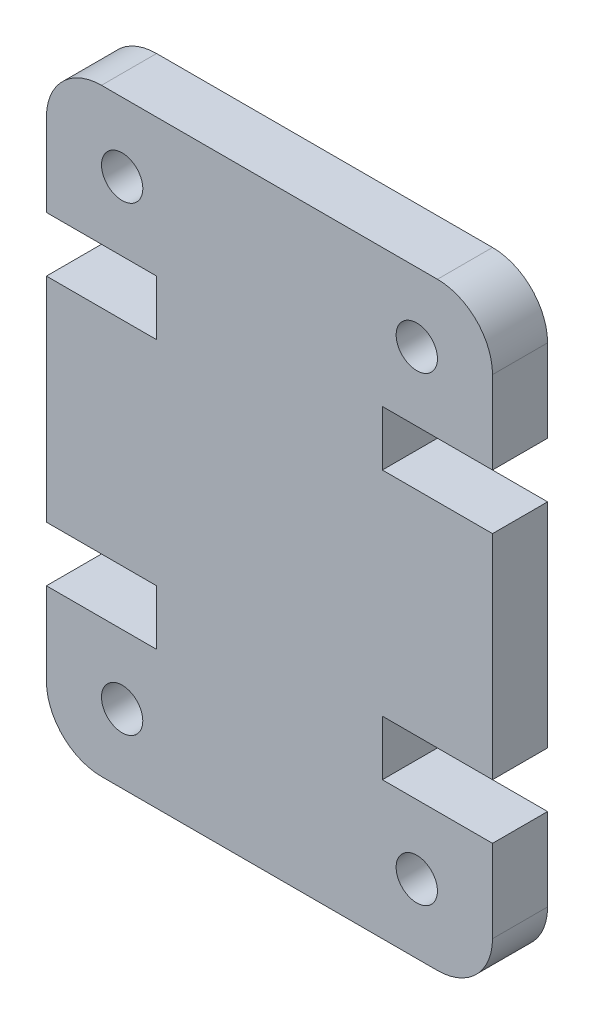
ISO-10303-21;
HEADER;
FILE_DESCRIPTION(('STEP AP214'),'2;1');
FILE_NAME('part.step','',(''),(''),'','','');
FILE_SCHEMA(('AUTOMOTIVE_DESIGN { 1 0 10303 214 1 1 1 1 }'));
ENDSEC;
DATA;
#1=APPLICATION_CONTEXT('core data for automotive mechanical design processes');
#2=APPLICATION_PROTOCOL_DEFINITION('international standard','automotive_design',2000,#1);
#3=PRODUCT_CONTEXT('',#1,'mechanical');
#4=PRODUCT('Part','Part','',(#3));
#5=PRODUCT_RELATED_PRODUCT_CATEGORY('part','',(#4));
#6=PRODUCT_DEFINITION_FORMATION('','',#4);
#7=PRODUCT_DEFINITION_CONTEXT('part definition',#1,'design');
#8=PRODUCT_DEFINITION('design','',#6,#7);
#9=PRODUCT_DEFINITION_SHAPE('','',#8);
#10=(LENGTH_UNIT() NAMED_UNIT(*) SI_UNIT(.MILLI.,.METRE.));
#11=(NAMED_UNIT(*) PLANE_ANGLE_UNIT() SI_UNIT($,.RADIAN.));
#12=(NAMED_UNIT(*) SI_UNIT($,.STERADIAN.) SOLID_ANGLE_UNIT());
#13=UNCERTAINTY_MEASURE_WITH_UNIT(LENGTH_MEASURE(1.E-05),#10,'distance_accuracy_value','');
#14=(GEOMETRIC_REPRESENTATION_CONTEXT(3) GLOBAL_UNCERTAINTY_ASSIGNED_CONTEXT((#13)) GLOBAL_UNIT_ASSIGNED_CONTEXT((#10,
#11,#12)) REPRESENTATION_CONTEXT('',''));
#15=CARTESIAN_POINT('',(0.,0.,0.));
#16=DIRECTION('',(0.,0.,1.));
#17=DIRECTION('',(1.,0.,0.));
#18=AXIS2_PLACEMENT_3D('',#15,#16,#17);
#19=CARTESIAN_POINT('',(14.2,2.,4.));
#20=DIRECTION('',(0.,0.,-1.));
#21=DIRECTION('',(-1.,0.,0.));
#22=AXIS2_PLACEMENT_3D('',#19,#20,#21);
#23=PLANE('',#22);
#24=CARTESIAN_POINT('',(2.75000000000004,19.2399999999998,4.));
#25=DIRECTION('',(0.,0.,1.));
#26=DIRECTION('',(-1.,0.,0.));
#27=AXIS2_PLACEMENT_3D('',#24,#25,#26);
#28=CIRCLE('',#27,0.75);
#29=CARTESIAN_POINT('',(2.00000000000004,19.2399999999998,4.));
#30=VERTEX_POINT('',#29);
#31=EDGE_CURVE('E357',#30,#30,#28,.T.);
#32=ORIENTED_EDGE('',*,*,#31,.F.);
#33=EDGE_LOOP('',(#32));
#34=FACE_BOUND('',#33,.T.);
#35=CARTESIAN_POINT('',(13.45,2.50000000000017,4.));
#36=DIRECTION('',(0.,0.,1.));
#37=DIRECTION('',(-1.,0.,0.));
#38=AXIS2_PLACEMENT_3D('',#35,#36,#37);
#39=CIRCLE('',#38,0.750000000000008);
#40=CARTESIAN_POINT('',(12.6999999999999,2.50000000000017,4.));
#41=VERTEX_POINT('',#40);
#42=EDGE_CURVE('E363',#41,#41,#39,.T.);
#43=ORIENTED_EDGE('',*,*,#42,.F.);
#44=EDGE_LOOP('',(#43));
#45=FACE_BOUND('',#44,.T.);
#46=CARTESIAN_POINT('',(14.2,2.,4.));
#47=DIRECTION('',(0.,0.,1.));
#48=DIRECTION('',(-1.,0.,0.));
#49=AXIS2_PLACEMENT_3D('',#46,#47,#48);
#50=CIRCLE('',#49,2.);
#51=CARTESIAN_POINT('',(14.2,0.,4.));
#52=VERTEX_POINT('',#51);
#53=CARTESIAN_POINT('',(16.2,2.,4.));
#54=VERTEX_POINT('',#53);
#55=EDGE_CURVE('E366',#52,#54,#50,.T.);
#56=ORIENTED_EDGE('',*,*,#55,.T.);
#57=DIRECTION('',(0.,1.,0.));
#58=VECTOR('',#57,1.);
#59=CARTESIAN_POINT('',(16.2,2.,4.));
#60=LINE('',#59,#58);
#61=CARTESIAN_POINT('',(16.2,4.99999999999945,4.));
#62=VERTEX_POINT('',#61);
#63=EDGE_CURVE('E296',#54,#62,#60,.T.);
#64=ORIENTED_EDGE('',*,*,#63,.T.);
#65=DIRECTION('',(-1.,0.,0.));
#66=VECTOR('',#65,1.);
#67=CARTESIAN_POINT('',(12.2,4.99999999999945,4.));
#68=LINE('',#67,#66);
#69=CARTESIAN_POINT('',(12.2,4.99999999999945,4.));
#70=VERTEX_POINT('',#69);
#71=EDGE_CURVE('E292',#62,#70,#68,.T.);
#72=ORIENTED_EDGE('',*,*,#71,.T.);
#73=DIRECTION('',(0.,1.,0.));
#74=VECTOR('',#73,1.);
#75=CARTESIAN_POINT('',(12.2,6.99999999999945,4.));
#76=LINE('',#75,#74);
#77=CARTESIAN_POINT('',(12.2,6.99999999999945,4.));
#78=VERTEX_POINT('',#77);
#79=EDGE_CURVE('E370',#70,#78,#76,.T.);
#80=ORIENTED_EDGE('',*,*,#79,.T.);
#81=DIRECTION('',(1.,0.,0.));
#82=VECTOR('',#81,1.);
#83=CARTESIAN_POINT('',(16.2,6.99999999999945,4.));
#84=LINE('',#83,#82);
#85=CARTESIAN_POINT('',(16.2,6.99999999999945,4.));
#86=VERTEX_POINT('',#85);
#87=EDGE_CURVE('E372',#78,#86,#84,.T.);
#88=ORIENTED_EDGE('',*,*,#87,.T.);
#89=DIRECTION('',(0.,1.,0.));
#90=VECTOR('',#89,1.);
#91=CARTESIAN_POINT('',(16.2,14.7400000000005,4.));
#92=LINE('',#91,#90);
#93=CARTESIAN_POINT('',(16.2,14.7400000000005,4.));
#94=VERTEX_POINT('',#93);
#95=EDGE_CURVE('E374',#86,#94,#92,.T.);
#96=ORIENTED_EDGE('',*,*,#95,.T.);
#97=DIRECTION('',(-1.,0.,0.));
#98=VECTOR('',#97,1.);
#99=CARTESIAN_POINT('',(16.2,14.7400000000005,4.));
#100=LINE('',#99,#98);
#101=CARTESIAN_POINT('',(12.2,14.7400000000005,4.));
#102=VERTEX_POINT('',#101);
#103=EDGE_CURVE('E376',#94,#102,#100,.T.);
#104=ORIENTED_EDGE('',*,*,#103,.T.);
#105=DIRECTION('',(0.,1.,0.));
#106=VECTOR('',#105,1.);
#107=CARTESIAN_POINT('',(12.2,14.7400000000005,4.));
#108=LINE('',#107,#106);
#109=CARTESIAN_POINT('',(12.2,16.7400000000005,4.));
#110=VERTEX_POINT('',#109);
#111=EDGE_CURVE('E378',#102,#110,#108,.T.);
#112=ORIENTED_EDGE('',*,*,#111,.T.);
#113=DIRECTION('',(1.,0.,0.));
#114=VECTOR('',#113,1.);
#115=CARTESIAN_POINT('',(12.2,16.7400000000005,4.));
#116=LINE('',#115,#114);
#117=CARTESIAN_POINT('',(16.2,16.7400000000005,4.));
#118=VERTEX_POINT('',#117);
#119=EDGE_CURVE('E380',#110,#118,#116,.T.);
#120=ORIENTED_EDGE('',*,*,#119,.T.);
#121=DIRECTION('',(0.,1.,0.));
#122=VECTOR('',#121,1.);
#123=CARTESIAN_POINT('',(16.2,19.74,4.));
#124=LINE('',#123,#122);
#125=CARTESIAN_POINT('',(16.2,19.74,4.));
#126=VERTEX_POINT('',#125);
#127=EDGE_CURVE('E382',#118,#126,#124,.T.);
#128=ORIENTED_EDGE('',*,*,#127,.T.);
#129=CARTESIAN_POINT('',(14.2,19.74,4.));
#130=DIRECTION('',(0.,0.,1.));
#131=DIRECTION('',(1.,0.,0.));
#132=AXIS2_PLACEMENT_3D('',#129,#130,#131);
#133=CIRCLE('',#132,2.);
#134=CARTESIAN_POINT('',(14.2,21.74,4.));
#135=VERTEX_POINT('',#134);
#136=EDGE_CURVE('E384',#126,#135,#133,.T.);
#137=ORIENTED_EDGE('',*,*,#136,.T.);
#138=DIRECTION('',(-1.,0.,0.));
#139=VECTOR('',#138,1.);
#140=CARTESIAN_POINT('',(1.99999999999999,21.74,4.));
#141=LINE('',#140,#139);
#142=CARTESIAN_POINT('',(1.99999999999999,21.74,4.));
#143=VERTEX_POINT('',#142);
#144=EDGE_CURVE('E386',#135,#143,#141,.T.);
#145=ORIENTED_EDGE('',*,*,#144,.T.);
#146=CARTESIAN_POINT('',(2.,19.74,4.));
#147=DIRECTION('',(0.,0.,1.));
#148=DIRECTION('',(-1.,0.,0.));
#149=AXIS2_PLACEMENT_3D('',#146,#147,#148);
#150=CIRCLE('',#149,2.);
#151=CARTESIAN_POINT('',(0.,19.74,4.));
#152=VERTEX_POINT('',#151);
#153=EDGE_CURVE('E388',#143,#152,#150,.T.);
#154=ORIENTED_EDGE('',*,*,#153,.T.);
#155=DIRECTION('',(0.,-1.,0.));
#156=VECTOR('',#155,1.);
#157=CARTESIAN_POINT('',(0.,19.74,4.));
#158=LINE('',#157,#156);
#159=CARTESIAN_POINT('',(0.,16.7400000000005,4.));
#160=VERTEX_POINT('',#159);
#161=EDGE_CURVE('E390',#152,#160,#158,.T.);
#162=ORIENTED_EDGE('',*,*,#161,.T.);
#163=DIRECTION('',(1.,0.,0.));
#164=VECTOR('',#163,1.);
#165=CARTESIAN_POINT('',(4.,16.7400000000005,4.));
#166=LINE('',#165,#164);
#167=CARTESIAN_POINT('',(4.,16.7400000000005,4.));
#168=VERTEX_POINT('',#167);
#169=EDGE_CURVE('E392',#160,#168,#166,.T.);
#170=ORIENTED_EDGE('',*,*,#169,.T.);
#171=DIRECTION('',(0.,-1.,0.));
#172=VECTOR('',#171,1.);
#173=CARTESIAN_POINT('',(4.,14.7400000000005,4.));
#174=LINE('',#173,#172);
#175=CARTESIAN_POINT('',(4.,14.7400000000005,4.));
#176=VERTEX_POINT('',#175);
#177=EDGE_CURVE('E394',#168,#176,#174,.T.);
#178=ORIENTED_EDGE('',*,*,#177,.T.);
#179=DIRECTION('',(-1.,0.,0.));
#180=VECTOR('',#179,1.);
#181=CARTESIAN_POINT('',(0.,14.7400000000005,4.));
#182=LINE('',#181,#180);
#183=CARTESIAN_POINT('',(0.,14.7400000000005,4.));
#184=VERTEX_POINT('',#183);
#185=EDGE_CURVE('E396',#176,#184,#182,.T.);
#186=ORIENTED_EDGE('',*,*,#185,.T.);
#187=DIRECTION('',(0.,-1.,0.));
#188=VECTOR('',#187,1.);
#189=CARTESIAN_POINT('',(0.,14.7400000000005,4.));
#190=LINE('',#189,#188);
#191=CARTESIAN_POINT('',(0.,6.99999999999946,4.));
#192=VERTEX_POINT('',#191);
#193=EDGE_CURVE('E398',#184,#192,#190,.T.);
#194=ORIENTED_EDGE('',*,*,#193,.T.);
#195=DIRECTION('',(1.,0.,0.));
#196=VECTOR('',#195,1.);
#197=CARTESIAN_POINT('',(0.,6.99999999999946,4.));
#198=LINE('',#197,#196);
#199=CARTESIAN_POINT('',(4.00000000000002,6.99999999999946,4.));
#200=VERTEX_POINT('',#199);
#201=EDGE_CURVE('E400',#192,#200,#198,.T.);
#202=ORIENTED_EDGE('',*,*,#201,.T.);
#203=DIRECTION('',(0.,-1.,0.));
#204=VECTOR('',#203,1.);
#205=CARTESIAN_POINT('',(4.00000000000002,6.99999999999946,4.));
#206=LINE('',#205,#204);
#207=CARTESIAN_POINT('',(4.,4.99999999999945,4.));
#208=VERTEX_POINT('',#207);
#209=EDGE_CURVE('E402',#200,#208,#206,.T.);
#210=ORIENTED_EDGE('',*,*,#209,.T.);
#211=DIRECTION('',(-1.,0.,0.));
#212=VECTOR('',#211,1.);
#213=CARTESIAN_POINT('',(4.,4.99999999999945,4.));
#214=LINE('',#213,#212);
#215=CARTESIAN_POINT('',(0.,4.99999999999945,4.));
#216=VERTEX_POINT('',#215);
#217=EDGE_CURVE('E404',#208,#216,#214,.T.);
#218=ORIENTED_EDGE('',*,*,#217,.T.);
#219=DIRECTION('',(0.,-1.,0.));
#220=VECTOR('',#219,1.);
#221=CARTESIAN_POINT('',(0.,2.,4.));
#222=LINE('',#221,#220);
#223=CARTESIAN_POINT('',(0.,2.,4.));
#224=VERTEX_POINT('',#223);
#225=EDGE_CURVE('E406',#216,#224,#222,.T.);
#226=ORIENTED_EDGE('',*,*,#225,.T.);
#227=CARTESIAN_POINT('',(2.00000000000002,2.,4.));
#228=DIRECTION('',(0.,0.,1.));
#229=DIRECTION('',(1.,0.,0.));
#230=AXIS2_PLACEMENT_3D('',#227,#228,#229);
#231=CIRCLE('',#230,2.00000000000001);
#232=CARTESIAN_POINT('',(2.00000000000002,0.,4.));
#233=VERTEX_POINT('',#232);
#234=EDGE_CURVE('E222',#224,#233,#231,.T.);
#235=ORIENTED_EDGE('',*,*,#234,.T.);
#236=DIRECTION('',(1.,0.,0.));
#237=VECTOR('',#236,1.);
#238=CARTESIAN_POINT('',(2.00000000000002,0.,4.));
#239=LINE('',#238,#237);
#240=EDGE_CURVE('E58',#233,#52,#239,.T.);
#241=ORIENTED_EDGE('',*,*,#240,.T.);
#242=EDGE_LOOP('',(#56,#64,#72,#80,#88,#96,#104,#112,#120,#128,#137,#145,#154,#162,#170,#178,
#186,#194,#202,#210,#218,#226,#235,#241));
#243=FACE_BOUND('',#242,.T.);
#244=CARTESIAN_POINT('',(2.75000000000004,2.50000000000017,4.));
#245=DIRECTION('',(0.,0.,1.));
#246=DIRECTION('',(1.,0.,0.));
#247=AXIS2_PLACEMENT_3D('',#244,#245,#246);
#248=CIRCLE('',#247,0.75);
#249=CARTESIAN_POINT('',(3.50000000000004,2.50000000000017,4.));
#250=VERTEX_POINT('',#249);
#251=EDGE_CURVE('E360',#250,#250,#248,.T.);
#252=ORIENTED_EDGE('',*,*,#251,.F.);
#253=EDGE_LOOP('',(#252));
#254=FACE_BOUND('',#253,.T.);
#255=CARTESIAN_POINT('',(13.45,19.2399999999998,4.));
#256=DIRECTION('',(0.,0.,1.));
#257=DIRECTION('',(1.,0.,0.));
#258=AXIS2_PLACEMENT_3D('',#255,#256,#257);
#259=CIRCLE('',#258,0.750000000000007);
#260=CARTESIAN_POINT('',(14.2,19.2399999999998,4.));
#261=VERTEX_POINT('',#260);
#262=EDGE_CURVE('E354',#261,#261,#259,.T.);
#263=ORIENTED_EDGE('',*,*,#262,.F.);
#264=EDGE_LOOP('',(#263));
#265=FACE_BOUND('',#264,.T.);
#266=ADVANCED_FACE('F34',(#34,#45,#243,#254,#265),#23,.F.);
#267=CARTESIAN_POINT('',(14.2,2.,4.));
#268=DIRECTION('',(0.,0.,-1.));
#269=DIRECTION('',(-1.,0.,0.));
#270=AXIS2_PLACEMENT_3D('',#267,#268,#269);
#271=CYLINDRICAL_SURFACE('',#270,2.);
#272=DIRECTION('',(0.,0.,-1.));
#273=VECTOR('',#272,1.);
#274=CARTESIAN_POINT('',(14.2,0.,4.));
#275=LINE('',#274,#273);
#276=CARTESIAN_POINT('',(14.2,0.,2.));
#277=VERTEX_POINT('',#276);
#278=EDGE_CURVE('E227',#52,#277,#275,.T.);
#279=ORIENTED_EDGE('',*,*,#278,.T.);
#280=CARTESIAN_POINT('',(14.2,2.,2.));
#281=DIRECTION('',(0.,0.,1.));
#282=DIRECTION('',(1.,0.,0.));
#283=AXIS2_PLACEMENT_3D('',#280,#281,#282);
#284=CIRCLE('',#283,2.);
#285=CARTESIAN_POINT('',(16.2,2.,2.));
#286=VERTEX_POINT('',#285);
#287=EDGE_CURVE('E50',#277,#286,#284,.T.);
#288=ORIENTED_EDGE('',*,*,#287,.T.);
#289=DIRECTION('',(0.,0.,-1.));
#290=VECTOR('',#289,1.);
#291=CARTESIAN_POINT('',(16.2,2.,4.));
#292=LINE('',#291,#290);
#293=EDGE_CURVE('E11',#54,#286,#292,.T.);
#294=ORIENTED_EDGE('',*,*,#293,.F.);
#295=ORIENTED_EDGE('',*,*,#55,.F.);
#296=EDGE_LOOP('',(#279,#288,#294,#295));
#297=FACE_BOUND('',#296,.T.);
#298=ADVANCED_FACE('F36',(#297),#271,.T.);
#299=CARTESIAN_POINT('',(16.2,2.,4.));
#300=DIRECTION('',(-1.,0.,0.));
#301=DIRECTION('',(0.,-1.,0.));
#302=AXIS2_PLACEMENT_3D('',#299,#300,#301);
#303=PLANE('',#302);
#304=ORIENTED_EDGE('',*,*,#293,.T.);
#305=DIRECTION('',(0.,-1.,0.));
#306=VECTOR('',#305,1.);
#307=CARTESIAN_POINT('',(16.2,0.,2.));
#308=LINE('',#307,#306);
#309=CARTESIAN_POINT('',(16.2,4.99999999999945,2.));
#310=VERTEX_POINT('',#309);
#311=EDGE_CURVE('E297',#310,#286,#308,.T.);
#312=ORIENTED_EDGE('',*,*,#311,.F.);
#313=DIRECTION('',(0.,0.,-1.));
#314=VECTOR('',#313,1.);
#315=CARTESIAN_POINT('',(16.2,4.99999999999945,4.));
#316=LINE('',#315,#314);
#317=EDGE_CURVE('E43',#62,#310,#316,.T.);
#318=ORIENTED_EDGE('',*,*,#317,.F.);
#319=ORIENTED_EDGE('',*,*,#63,.F.);
#320=EDGE_LOOP('',(#304,#312,#318,#319));
#321=FACE_BOUND('',#320,.T.);
#322=ADVANCED_FACE('F295',(#321),#303,.F.);
#323=CARTESIAN_POINT('',(12.2,4.99999999999945,4.));
#324=DIRECTION('',(0.,-1.,0.));
#325=DIRECTION('',(0.,0.,-1.));
#326=AXIS2_PLACEMENT_3D('',#323,#324,#325);
#327=PLANE('',#326);
#328=ORIENTED_EDGE('',*,*,#317,.T.);
#329=DIRECTION('',(-1.,0.,0.));
#330=VECTOR('',#329,1.);
#331=CARTESIAN_POINT('',(12.2,4.99999999999945,2.));
#332=LINE('',#331,#330);
#333=CARTESIAN_POINT('',(12.2,4.99999999999945,2.));
#334=VERTEX_POINT('',#333);
#335=EDGE_CURVE('E291',#310,#334,#332,.T.);
#336=ORIENTED_EDGE('',*,*,#335,.T.);
#337=DIRECTION('',(0.,0.,-1.));
#338=VECTOR('',#337,1.);
#339=CARTESIAN_POINT('',(12.2,4.99999999999945,4.));
#340=LINE('',#339,#338);
#341=EDGE_CURVE('E281',#70,#334,#340,.T.);
#342=ORIENTED_EDGE('',*,*,#341,.F.);
#343=ORIENTED_EDGE('',*,*,#71,.F.);
#344=EDGE_LOOP('',(#328,#336,#342,#343));
#345=FACE_BOUND('',#344,.T.);
#346=ADVANCED_FACE('F289',(#345),#327,.F.);
#347=CARTESIAN_POINT('',(12.2,6.99999999999945,4.));
#348=DIRECTION('',(-1.,0.,0.));
#349=DIRECTION('',(0.,0.,1.));
#350=AXIS2_PLACEMENT_3D('',#347,#348,#349);
#351=PLANE('',#350);
#352=ORIENTED_EDGE('',*,*,#341,.T.);
#353=DIRECTION('',(0.,1.,0.));
#354=VECTOR('',#353,1.);
#355=CARTESIAN_POINT('',(12.2,6.99999999999945,2.));
#356=LINE('',#355,#354);
#357=CARTESIAN_POINT('',(12.2,6.99999999999945,2.));
#358=VERTEX_POINT('',#357);
#359=EDGE_CURVE('E349',#334,#358,#356,.T.);
#360=ORIENTED_EDGE('',*,*,#359,.T.);
#361=DIRECTION('',(0.,0.,-1.));
#362=VECTOR('',#361,1.);
#363=CARTESIAN_POINT('',(12.2,6.99999999999945,4.));
#364=LINE('',#363,#362);
#365=EDGE_CURVE('E278',#78,#358,#364,.T.);
#366=ORIENTED_EDGE('',*,*,#365,.F.);
#367=ORIENTED_EDGE('',*,*,#79,.F.);
#368=EDGE_LOOP('',(#352,#360,#366,#367));
#369=FACE_BOUND('',#368,.T.);
#370=ADVANCED_FACE('F468',(#369),#351,.F.);
#371=CARTESIAN_POINT('',(16.2,6.99999999999945,4.));
#372=DIRECTION('',(0.,1.,0.));
#373=DIRECTION('',(-1.,0.,0.));
#374=AXIS2_PLACEMENT_3D('',#371,#372,#373);
#375=PLANE('',#374);
#376=ORIENTED_EDGE('',*,*,#365,.T.);
#377=DIRECTION('',(1.,0.,0.));
#378=VECTOR('',#377,1.);
#379=CARTESIAN_POINT('',(16.2,6.99999999999945,2.));
#380=LINE('',#379,#378);
#381=CARTESIAN_POINT('',(16.2,6.99999999999945,2.));
#382=VERTEX_POINT('',#381);
#383=EDGE_CURVE('E346',#358,#382,#380,.T.);
#384=ORIENTED_EDGE('',*,*,#383,.T.);
#385=DIRECTION('',(0.,0.,-1.));
#386=VECTOR('',#385,1.);
#387=CARTESIAN_POINT('',(16.2,6.99999999999945,4.));
#388=LINE('',#387,#386);
#389=EDGE_CURVE('E275',#86,#382,#388,.T.);
#390=ORIENTED_EDGE('',*,*,#389,.F.);
#391=ORIENTED_EDGE('',*,*,#87,.F.);
#392=EDGE_LOOP('',(#376,#384,#390,#391));
#393=FACE_BOUND('',#392,.T.);
#394=ADVANCED_FACE('F472',(#393),#375,.F.);
#395=CARTESIAN_POINT('',(16.2,14.7400000000005,4.));
#396=DIRECTION('',(-1.,0.,0.));
#397=DIRECTION('',(0.,0.,1.));
#398=AXIS2_PLACEMENT_3D('',#395,#396,#397);
#399=PLANE('',#398);
#400=ORIENTED_EDGE('',*,*,#389,.T.);
#401=CARTESIAN_POINT('',(16.2,14.7400000000005,2.));
#402=VERTEX_POINT('',#401);
#403=EDGE_CURVE('E299',#402,#382,#308,.T.);
#404=ORIENTED_EDGE('',*,*,#403,.F.);
#405=DIRECTION('',(0.,0.,-1.));
#406=VECTOR('',#405,1.);
#407=CARTESIAN_POINT('',(16.2,14.7400000000005,4.));
#408=LINE('',#407,#406);
#409=EDGE_CURVE('E272',#94,#402,#408,.T.);
#410=ORIENTED_EDGE('',*,*,#409,.F.);
#411=ORIENTED_EDGE('',*,*,#95,.F.);
#412=EDGE_LOOP('',(#400,#404,#410,#411));
#413=FACE_BOUND('',#412,.T.);
#414=ADVANCED_FACE('F479',(#413),#399,.F.);
#415=CARTESIAN_POINT('',(16.2,14.7400000000005,4.));
#416=DIRECTION('',(0.,-1.,0.));
#417=DIRECTION('',(1.,0.,0.));
#418=AXIS2_PLACEMENT_3D('',#415,#416,#417);
#419=PLANE('',#418);
#420=ORIENTED_EDGE('',*,*,#409,.T.);
#421=DIRECTION('',(-1.,0.,0.));
#422=VECTOR('',#421,1.);
#423=CARTESIAN_POINT('',(16.2,14.7400000000005,2.));
#424=LINE('',#423,#422);
#425=CARTESIAN_POINT('',(12.2,14.7400000000005,2.));
#426=VERTEX_POINT('',#425);
#427=EDGE_CURVE('E343',#402,#426,#424,.T.);
#428=ORIENTED_EDGE('',*,*,#427,.T.);
#429=DIRECTION('',(0.,0.,-1.));
#430=VECTOR('',#429,1.);
#431=CARTESIAN_POINT('',(12.2,14.7400000000005,4.));
#432=LINE('',#431,#430);
#433=EDGE_CURVE('E269',#102,#426,#432,.T.);
#434=ORIENTED_EDGE('',*,*,#433,.F.);
#435=ORIENTED_EDGE('',*,*,#103,.F.);
#436=EDGE_LOOP('',(#420,#428,#434,#435));
#437=FACE_BOUND('',#436,.T.);
#438=ADVANCED_FACE('F481',(#437),#419,.F.);
#439=CARTESIAN_POINT('',(12.2,14.7400000000005,4.));
#440=DIRECTION('',(-1.,0.,0.));
#441=DIRECTION('',(0.,0.,1.));
#442=AXIS2_PLACEMENT_3D('',#439,#440,#441);
#443=PLANE('',#442);
#444=ORIENTED_EDGE('',*,*,#433,.T.);
#445=DIRECTION('',(0.,1.,0.));
#446=VECTOR('',#445,1.);
#447=CARTESIAN_POINT('',(12.2,14.7400000000005,2.));
#448=LINE('',#447,#446);
#449=CARTESIAN_POINT('',(12.2,16.7400000000005,2.));
#450=VERTEX_POINT('',#449);
#451=EDGE_CURVE('E340',#426,#450,#448,.T.);
#452=ORIENTED_EDGE('',*,*,#451,.T.);
#453=DIRECTION('',(0.,0.,-1.));
#454=VECTOR('',#453,1.);
#455=CARTESIAN_POINT('',(12.2,16.7400000000005,4.));
#456=LINE('',#455,#454);
#457=EDGE_CURVE('E266',#110,#450,#456,.T.);
#458=ORIENTED_EDGE('',*,*,#457,.F.);
#459=ORIENTED_EDGE('',*,*,#111,.F.);
#460=EDGE_LOOP('',(#444,#452,#458,#459));
#461=FACE_BOUND('',#460,.T.);
#462=ADVANCED_FACE('F485',(#461),#443,.F.);
#463=CARTESIAN_POINT('',(12.2,16.7400000000005,4.));
#464=DIRECTION('',(0.,1.,0.));
#465=DIRECTION('',(0.,0.,1.));
#466=AXIS2_PLACEMENT_3D('',#463,#464,#465);
#467=PLANE('',#466);
#468=ORIENTED_EDGE('',*,*,#457,.T.);
#469=DIRECTION('',(1.,0.,0.));
#470=VECTOR('',#469,1.);
#471=CARTESIAN_POINT('',(12.2,16.7400000000005,2.));
#472=LINE('',#471,#470);
#473=CARTESIAN_POINT('',(16.2,16.7400000000005,2.));
#474=VERTEX_POINT('',#473);
#475=EDGE_CURVE('E338',#450,#474,#472,.T.);
#476=ORIENTED_EDGE('',*,*,#475,.T.);
#477=DIRECTION('',(0.,0.,-1.));
#478=VECTOR('',#477,1.);
#479=CARTESIAN_POINT('',(16.2,16.7400000000005,4.));
#480=LINE('',#479,#478);
#481=EDGE_CURVE('E263',#118,#474,#480,.T.);
#482=ORIENTED_EDGE('',*,*,#481,.F.);
#483=ORIENTED_EDGE('',*,*,#119,.F.);
#484=EDGE_LOOP('',(#468,#476,#482,#483));
#485=FACE_BOUND('',#484,.T.);
#486=ADVANCED_FACE('F491',(#485),#467,.F.);
#487=CARTESIAN_POINT('',(16.2,19.74,4.));
#488=DIRECTION('',(-1.,0.,0.));
#489=DIRECTION('',(0.,-1.,0.));
#490=AXIS2_PLACEMENT_3D('',#487,#488,#489);
#491=PLANE('',#490);
#492=ORIENTED_EDGE('',*,*,#481,.T.);
#493=CARTESIAN_POINT('',(16.2,19.74,2.));
#494=VERTEX_POINT('',#493);
#495=EDGE_CURVE('E301',#494,#474,#308,.T.);
#496=ORIENTED_EDGE('',*,*,#495,.F.);
#497=DIRECTION('',(0.,0.,-1.));
#498=VECTOR('',#497,1.);
#499=CARTESIAN_POINT('',(16.2,19.74,4.));
#500=LINE('',#499,#498);
#501=EDGE_CURVE('E260',#126,#494,#500,.T.);
#502=ORIENTED_EDGE('',*,*,#501,.F.);
#503=ORIENTED_EDGE('',*,*,#127,.F.);
#504=EDGE_LOOP('',(#492,#496,#502,#503));
#505=FACE_BOUND('',#504,.T.);
#506=ADVANCED_FACE('F493',(#505),#491,.F.);
#507=CARTESIAN_POINT('',(14.2,19.74,4.));
#508=DIRECTION('',(0.,0.,-1.));
#509=DIRECTION('',(-1.,0.,0.));
#510=AXIS2_PLACEMENT_3D('',#507,#508,#509);
#511=CYLINDRICAL_SURFACE('',#510,2.);
#512=ORIENTED_EDGE('',*,*,#501,.T.);
#513=CARTESIAN_POINT('',(14.2,19.74,2.));
#514=DIRECTION('',(0.,0.,1.));
#515=DIRECTION('',(1.,0.,0.));
#516=AXIS2_PLACEMENT_3D('',#513,#514,#515);
#517=CIRCLE('',#516,2.);
#518=CARTESIAN_POINT('',(14.2,21.74,2.));
#519=VERTEX_POINT('',#518);
#520=EDGE_CURVE('E335',#494,#519,#517,.T.);
#521=ORIENTED_EDGE('',*,*,#520,.T.);
#522=DIRECTION('',(0.,0.,-1.));
#523=VECTOR('',#522,1.);
#524=CARTESIAN_POINT('',(14.2,21.74,4.));
#525=LINE('',#524,#523);
#526=EDGE_CURVE('E257',#135,#519,#525,.T.);
#527=ORIENTED_EDGE('',*,*,#526,.F.);
#528=ORIENTED_EDGE('',*,*,#136,.F.);
#529=EDGE_LOOP('',(#512,#521,#527,#528));
#530=FACE_BOUND('',#529,.T.);
#531=ADVANCED_FACE('F497',(#530),#511,.T.);
#532=CARTESIAN_POINT('',(1.99999999999999,21.74,4.));
#533=DIRECTION('',(0.,-1.,0.));
#534=DIRECTION('',(0.,0.,-1.));
#535=AXIS2_PLACEMENT_3D('',#532,#533,#534);
#536=PLANE('',#535);
#537=ORIENTED_EDGE('',*,*,#526,.T.);
#538=DIRECTION('',(1.,0.,0.));
#539=VECTOR('',#538,1.);
#540=CARTESIAN_POINT('',(16.2,21.74,2.));
#541=LINE('',#540,#539);
#542=CARTESIAN_POINT('',(2.,21.74,2.));
#543=VERTEX_POINT('',#542);
#544=EDGE_CURVE('E217',#543,#519,#541,.T.);
#545=ORIENTED_EDGE('',*,*,#544,.F.);
#546=DIRECTION('',(0.,0.,-1.));
#547=VECTOR('',#546,1.);
#548=CARTESIAN_POINT('',(1.99999999999999,21.74,4.));
#549=LINE('',#548,#547);
#550=EDGE_CURVE('E254',#143,#543,#549,.T.);
#551=ORIENTED_EDGE('',*,*,#550,.F.);
#552=ORIENTED_EDGE('',*,*,#144,.F.);
#553=EDGE_LOOP('',(#537,#545,#551,#552));
#554=FACE_BOUND('',#553,.T.);
#555=ADVANCED_FACE('F504',(#554),#536,.F.);
#556=CARTESIAN_POINT('',(2.,19.74,4.));
#557=DIRECTION('',(0.,0.,-1.));
#558=DIRECTION('',(-1.,0.,0.));
#559=AXIS2_PLACEMENT_3D('',#556,#557,#558);
#560=CYLINDRICAL_SURFACE('',#559,2.);
#561=ORIENTED_EDGE('',*,*,#550,.T.);
#562=CARTESIAN_POINT('',(2.,19.74,2.));
#563=DIRECTION('',(0.,0.,1.));
#564=DIRECTION('',(1.,0.,0.));
#565=AXIS2_PLACEMENT_3D('',#562,#563,#564);
#566=CIRCLE('',#565,2.);
#567=CARTESIAN_POINT('',(0.,19.74,2.));
#568=VERTEX_POINT('',#567);
#569=EDGE_CURVE('E332',#543,#568,#566,.T.);
#570=ORIENTED_EDGE('',*,*,#569,.T.);
#571=DIRECTION('',(0.,0.,-1.));
#572=VECTOR('',#571,1.);
#573=CARTESIAN_POINT('',(0.,19.74,4.));
#574=LINE('',#573,#572);
#575=EDGE_CURVE('E251',#152,#568,#574,.T.);
#576=ORIENTED_EDGE('',*,*,#575,.F.);
#577=ORIENTED_EDGE('',*,*,#153,.F.);
#578=EDGE_LOOP('',(#561,#570,#576,#577));
#579=FACE_BOUND('',#578,.T.);
#580=ADVANCED_FACE('F506',(#579),#560,.T.);
#581=CARTESIAN_POINT('',(0.,19.74,4.));
#582=DIRECTION('',(1.,0.,0.));
#583=DIRECTION('',(0.,1.,0.));
#584=AXIS2_PLACEMENT_3D('',#581,#582,#583);
#585=PLANE('',#584);
#586=ORIENTED_EDGE('',*,*,#575,.T.);
#587=DIRECTION('',(0.,1.,0.));
#588=VECTOR('',#587,1.);
#589=CARTESIAN_POINT('',(0.,21.74,2.));
#590=LINE('',#589,#588);
#591=CARTESIAN_POINT('',(0.,16.7400000000005,2.));
#592=VERTEX_POINT('',#591);
#593=EDGE_CURVE('E220',#592,#568,#590,.T.);
#594=ORIENTED_EDGE('',*,*,#593,.F.);
#595=DIRECTION('',(0.,0.,-1.));
#596=VECTOR('',#595,1.);
#597=CARTESIAN_POINT('',(0.,16.7400000000005,4.));
#598=LINE('',#597,#596);
#599=EDGE_CURVE('E248',#160,#592,#598,.T.);
#600=ORIENTED_EDGE('',*,*,#599,.F.);
#601=ORIENTED_EDGE('',*,*,#161,.F.);
#602=EDGE_LOOP('',(#586,#594,#600,#601));
#603=FACE_BOUND('',#602,.T.);
#604=ADVANCED_FACE('F511',(#603),#585,.F.);
#605=CARTESIAN_POINT('',(4.,16.7400000000005,4.));
#606=DIRECTION('',(0.,1.,0.));
#607=DIRECTION('',(-1.,0.,0.));
#608=AXIS2_PLACEMENT_3D('',#605,#606,#607);
#609=PLANE('',#608);
#610=ORIENTED_EDGE('',*,*,#599,.T.);
#611=DIRECTION('',(1.,0.,0.));
#612=VECTOR('',#611,1.);
#613=CARTESIAN_POINT('',(4.,16.7400000000005,2.));
#614=LINE('',#613,#612);
#615=CARTESIAN_POINT('',(4.,16.7400000000005,2.));
#616=VERTEX_POINT('',#615);
#617=EDGE_CURVE('E329',#592,#616,#614,.T.);
#618=ORIENTED_EDGE('',*,*,#617,.T.);
#619=DIRECTION('',(0.,0.,-1.));
#620=VECTOR('',#619,1.);
#621=CARTESIAN_POINT('',(4.,16.7400000000005,4.));
#622=LINE('',#621,#620);
#623=EDGE_CURVE('E245',#168,#616,#622,.T.);
#624=ORIENTED_EDGE('',*,*,#623,.F.);
#625=ORIENTED_EDGE('',*,*,#169,.F.);
#626=EDGE_LOOP('',(#610,#618,#624,#625));
#627=FACE_BOUND('',#626,.T.);
#628=ADVANCED_FACE('F517',(#627),#609,.F.);
#629=CARTESIAN_POINT('',(4.,14.7400000000005,4.));
#630=DIRECTION('',(1.,0.,0.));
#631=DIRECTION('',(0.,0.,-1.));
#632=AXIS2_PLACEMENT_3D('',#629,#630,#631);
#633=PLANE('',#632);
#634=ORIENTED_EDGE('',*,*,#623,.T.);
#635=DIRECTION('',(0.,-1.,0.));
#636=VECTOR('',#635,1.);
#637=CARTESIAN_POINT('',(4.,14.7400000000005,2.));
#638=LINE('',#637,#636);
#639=CARTESIAN_POINT('',(4.,14.7400000000005,2.));
#640=VERTEX_POINT('',#639);
#641=EDGE_CURVE('E326',#616,#640,#638,.T.);
#642=ORIENTED_EDGE('',*,*,#641,.T.);
#643=DIRECTION('',(0.,0.,-1.));
#644=VECTOR('',#643,1.);
#645=CARTESIAN_POINT('',(4.,14.7400000000005,4.));
#646=LINE('',#645,#644);
#647=EDGE_CURVE('E242',#176,#640,#646,.T.);
#648=ORIENTED_EDGE('',*,*,#647,.F.);
#649=ORIENTED_EDGE('',*,*,#177,.F.);
#650=EDGE_LOOP('',(#634,#642,#648,#649));
#651=FACE_BOUND('',#650,.T.);
#652=ADVANCED_FACE('F519',(#651),#633,.F.);
#653=CARTESIAN_POINT('',(0.,14.7400000000005,4.));
#654=DIRECTION('',(0.,-1.,0.));
#655=DIRECTION('',(1.,0.,0.));
#656=AXIS2_PLACEMENT_3D('',#653,#654,#655);
#657=PLANE('',#656);
#658=ORIENTED_EDGE('',*,*,#647,.T.);
#659=DIRECTION('',(-1.,0.,0.));
#660=VECTOR('',#659,1.);
#661=CARTESIAN_POINT('',(0.,14.7400000000005,2.));
#662=LINE('',#661,#660);
#663=CARTESIAN_POINT('',(0.,14.7400000000005,2.));
#664=VERTEX_POINT('',#663);
#665=EDGE_CURVE('E323',#640,#664,#662,.T.);
#666=ORIENTED_EDGE('',*,*,#665,.T.);
#667=DIRECTION('',(0.,0.,-1.));
#668=VECTOR('',#667,1.);
#669=CARTESIAN_POINT('',(0.,14.7400000000005,4.));
#670=LINE('',#669,#668);
#671=EDGE_CURVE('E239',#184,#664,#670,.T.);
#672=ORIENTED_EDGE('',*,*,#671,.F.);
#673=ORIENTED_EDGE('',*,*,#185,.F.);
#674=EDGE_LOOP('',(#658,#666,#672,#673));
#675=FACE_BOUND('',#674,.T.);
#676=ADVANCED_FACE('F523',(#675),#657,.F.);
#677=CARTESIAN_POINT('',(0.,14.7400000000005,4.));
#678=DIRECTION('',(1.,0.,0.));
#679=DIRECTION('',(0.,1.,0.));
#680=AXIS2_PLACEMENT_3D('',#677,#678,#679);
#681=PLANE('',#680);
#682=ORIENTED_EDGE('',*,*,#671,.T.);
#683=CARTESIAN_POINT('',(0.,6.99999999999946,2.));
#684=VERTEX_POINT('',#683);
#685=EDGE_CURVE('E218',#684,#664,#590,.T.);
#686=ORIENTED_EDGE('',*,*,#685,.F.);
#687=DIRECTION('',(0.,0.,-1.));
#688=VECTOR('',#687,1.);
#689=CARTESIAN_POINT('',(0.,6.99999999999946,4.));
#690=LINE('',#689,#688);
#691=EDGE_CURVE('E236',#192,#684,#690,.T.);
#692=ORIENTED_EDGE('',*,*,#691,.F.);
#693=ORIENTED_EDGE('',*,*,#193,.F.);
#694=EDGE_LOOP('',(#682,#686,#692,#693));
#695=FACE_BOUND('',#694,.T.);
#696=ADVANCED_FACE('F530',(#695),#681,.F.);
#697=CARTESIAN_POINT('',(0.,6.99999999999946,4.));
#698=DIRECTION('',(0.,1.,0.));
#699=DIRECTION('',(0.,0.,1.));
#700=AXIS2_PLACEMENT_3D('',#697,#698,#699);
#701=PLANE('',#700);
#702=ORIENTED_EDGE('',*,*,#691,.T.);
#703=DIRECTION('',(1.,0.,0.));
#704=VECTOR('',#703,1.);
#705=CARTESIAN_POINT('',(0.,6.99999999999946,2.));
#706=LINE('',#705,#704);
#707=CARTESIAN_POINT('',(4.00000000000002,6.99999999999946,2.));
#708=VERTEX_POINT('',#707);
#709=EDGE_CURVE('E320',#684,#708,#706,.T.);
#710=ORIENTED_EDGE('',*,*,#709,.T.);
#711=DIRECTION('',(0.,0.,-1.));
#712=VECTOR('',#711,1.);
#713=CARTESIAN_POINT('',(4.00000000000002,6.99999999999946,4.));
#714=LINE('',#713,#712);
#715=EDGE_CURVE('E233',#200,#708,#714,.T.);
#716=ORIENTED_EDGE('',*,*,#715,.F.);
#717=ORIENTED_EDGE('',*,*,#201,.F.);
#718=EDGE_LOOP('',(#702,#710,#716,#717));
#719=FACE_BOUND('',#718,.T.);
#720=ADVANCED_FACE('F532',(#719),#701,.F.);
#721=CARTESIAN_POINT('',(4.00000000000002,6.99999999999946,4.));
#722=DIRECTION('',(1.,0.,0.));
#723=DIRECTION('',(0.,1.,0.));
#724=AXIS2_PLACEMENT_3D('',#721,#722,#723);
#725=PLANE('',#724);
#726=ORIENTED_EDGE('',*,*,#715,.T.);
#727=DIRECTION('',(0.,-1.,0.));
#728=VECTOR('',#727,1.);
#729=CARTESIAN_POINT('',(4.00000000000002,6.99999999999946,2.));
#730=LINE('',#729,#728);
#731=CARTESIAN_POINT('',(4.,4.99999999999945,2.));
#732=VERTEX_POINT('',#731);
#733=EDGE_CURVE('E317',#708,#732,#730,.T.);
#734=ORIENTED_EDGE('',*,*,#733,.T.);
#735=DIRECTION('',(0.,0.,-1.));
#736=VECTOR('',#735,1.);
#737=CARTESIAN_POINT('',(4.,4.99999999999945,4.));
#738=LINE('',#737,#736);
#739=EDGE_CURVE('E225',#208,#732,#738,.T.);
#740=ORIENTED_EDGE('',*,*,#739,.F.);
#741=ORIENTED_EDGE('',*,*,#209,.F.);
#742=EDGE_LOOP('',(#726,#734,#740,#741));
#743=FACE_BOUND('',#742,.T.);
#744=ADVANCED_FACE('F536',(#743),#725,.F.);
#745=CARTESIAN_POINT('',(4.,4.99999999999945,4.));
#746=DIRECTION('',(0.,-1.,0.));
#747=DIRECTION('',(0.,0.,-1.));
#748=AXIS2_PLACEMENT_3D('',#745,#746,#747);
#749=PLANE('',#748);
#750=ORIENTED_EDGE('',*,*,#739,.T.);
#751=DIRECTION('',(-1.,0.,0.));
#752=VECTOR('',#751,1.);
#753=CARTESIAN_POINT('',(4.,4.99999999999945,2.));
#754=LINE('',#753,#752);
#755=CARTESIAN_POINT('',(0.,4.99999999999946,2.));
#756=VERTEX_POINT('',#755);
#757=EDGE_CURVE('E205',#732,#756,#754,.T.);
#758=ORIENTED_EDGE('',*,*,#757,.T.);
#759=DIRECTION('',(0.,0.,-1.));
#760=VECTOR('',#759,1.);
#761=CARTESIAN_POINT('',(0.,4.99999999999945,4.));
#762=LINE('',#761,#760);
#763=EDGE_CURVE('E216',#216,#756,#762,.T.);
#764=ORIENTED_EDGE('',*,*,#763,.F.);
#765=ORIENTED_EDGE('',*,*,#217,.F.);
#766=EDGE_LOOP('',(#750,#758,#764,#765));
#767=FACE_BOUND('',#766,.T.);
#768=ADVANCED_FACE('F539',(#767),#749,.F.);
#769=CARTESIAN_POINT('',(0.,2.,4.));
#770=DIRECTION('',(1.,0.,0.));
#771=DIRECTION('',(0.,0.,-1.));
#772=AXIS2_PLACEMENT_3D('',#769,#770,#771);
#773=PLANE('',#772);
#774=ORIENTED_EDGE('',*,*,#763,.T.);
#775=CARTESIAN_POINT('',(0.,2.,2.));
#776=VERTEX_POINT('',#775);
#777=EDGE_CURVE('E198',#776,#756,#590,.T.);
#778=ORIENTED_EDGE('',*,*,#777,.F.);
#779=DIRECTION('',(0.,0.,-1.));
#780=VECTOR('',#779,1.);
#781=CARTESIAN_POINT('',(0.,2.,4.));
#782=LINE('',#781,#780);
#783=EDGE_CURVE('E213',#224,#776,#782,.T.);
#784=ORIENTED_EDGE('',*,*,#783,.F.);
#785=ORIENTED_EDGE('',*,*,#225,.F.);
#786=EDGE_LOOP('',(#774,#778,#784,#785));
#787=FACE_BOUND('',#786,.T.);
#788=ADVANCED_FACE('F211',(#787),#773,.F.);
#789=CARTESIAN_POINT('',(2.00000000000002,2.,4.));
#790=DIRECTION('',(0.,0.,-1.));
#791=DIRECTION('',(-1.,0.,0.));
#792=AXIS2_PLACEMENT_3D('',#789,#790,#791);
#793=CYLINDRICAL_SURFACE('',#792,2.00000000000001);
#794=ORIENTED_EDGE('',*,*,#783,.T.);
#795=CARTESIAN_POINT('',(2.00000000000002,2.,2.));
#796=DIRECTION('',(0.,0.,1.));
#797=DIRECTION('',(1.,0.,0.));
#798=AXIS2_PLACEMENT_3D('',#795,#796,#797);
#799=CIRCLE('',#798,2.00000000000001);
#800=CARTESIAN_POINT('',(2.00000000000002,0.,2.));
#801=VERTEX_POINT('',#800);
#802=EDGE_CURVE('E195',#776,#801,#799,.T.);
#803=ORIENTED_EDGE('',*,*,#802,.T.);
#804=DIRECTION('',(0.,0.,-1.));
#805=VECTOR('',#804,1.);
#806=CARTESIAN_POINT('',(2.00000000000002,0.,4.));
#807=LINE('',#806,#805);
#808=EDGE_CURVE('E223',#233,#801,#807,.T.);
#809=ORIENTED_EDGE('',*,*,#808,.F.);
#810=ORIENTED_EDGE('',*,*,#234,.F.);
#811=EDGE_LOOP('',(#794,#803,#809,#810));
#812=FACE_BOUND('',#811,.T.);
#813=ADVANCED_FACE('F221',(#812),#793,.T.);
#814=CARTESIAN_POINT('',(2.00000000000002,0.,4.));
#815=DIRECTION('',(0.,1.,0.));
#816=DIRECTION('',(-1.,0.,0.));
#817=AXIS2_PLACEMENT_3D('',#814,#815,#816);
#818=PLANE('',#817);
#819=ORIENTED_EDGE('',*,*,#808,.T.);
#820=DIRECTION('',(-1.,0.,0.));
#821=VECTOR('',#820,1.);
#822=CARTESIAN_POINT('',(0.,0.,2.));
#823=LINE('',#822,#821);
#824=EDGE_CURVE('E200',#277,#801,#823,.T.);
#825=ORIENTED_EDGE('',*,*,#824,.F.);
#826=ORIENTED_EDGE('',*,*,#278,.F.);
#827=ORIENTED_EDGE('',*,*,#240,.F.);
#828=EDGE_LOOP('',(#819,#825,#826,#827));
#829=FACE_BOUND('',#828,.T.);
#830=ADVANCED_FACE('F413',(#829),#818,.F.);
#831=CARTESIAN_POINT('',(13.45,2.50000000000017,4.));
#832=DIRECTION('',(0.,0.,-1.));
#833=DIRECTION('',(-1.,0.,0.));
#834=AXIS2_PLACEMENT_3D('',#831,#832,#833);
#835=CYLINDRICAL_SURFACE('',#834,0.750000000000008);
#836=CARTESIAN_POINT('',(13.45,2.50000000000017,2.));
#837=DIRECTION('',(0.,0.,1.));
#838=DIRECTION('',(1.,0.,0.));
#839=AXIS2_PLACEMENT_3D('',#836,#837,#838);
#840=CIRCLE('',#839,0.750000000000008);
#841=CARTESIAN_POINT('',(14.2,2.50000000000017,2.));
#842=VERTEX_POINT('',#841);
#843=EDGE_CURVE('E206',#842,#842,#840,.T.);
#844=ORIENTED_EDGE('',*,*,#843,.F.);
#845=EDGE_LOOP('',(#844));
#846=FACE_BOUND('',#845,.T.);
#847=ORIENTED_EDGE('',*,*,#42,.T.);
#848=EDGE_LOOP('',(#847));
#849=FACE_BOUND('',#848,.T.);
#850=ADVANCED_FACE('F415',(#846,#849),#835,.F.);
#851=CARTESIAN_POINT('',(2.75000000000004,2.50000000000017,4.));
#852=DIRECTION('',(0.,0.,-1.));
#853=DIRECTION('',(-1.,0.,0.));
#854=AXIS2_PLACEMENT_3D('',#851,#852,#853);
#855=CYLINDRICAL_SURFACE('',#854,0.75);
#856=CARTESIAN_POINT('',(2.75000000000004,2.50000000000017,2.));
#857=DIRECTION('',(0.,0.,1.));
#858=DIRECTION('',(1.,0.,0.));
#859=AXIS2_PLACEMENT_3D('',#856,#857,#858);
#860=CIRCLE('',#859,0.75);
#861=CARTESIAN_POINT('',(3.50000000000004,2.50000000000017,2.));
#862=VERTEX_POINT('',#861);
#863=EDGE_CURVE('E311',#862,#862,#860,.T.);
#864=ORIENTED_EDGE('',*,*,#863,.F.);
#865=EDGE_LOOP('',(#864));
#866=FACE_BOUND('',#865,.T.);
#867=ORIENTED_EDGE('',*,*,#251,.T.);
#868=EDGE_LOOP('',(#867));
#869=FACE_BOUND('',#868,.T.);
#870=ADVANCED_FACE('F421',(#866,#869),#855,.F.);
#871=CARTESIAN_POINT('',(2.75000000000004,19.2399999999998,4.));
#872=DIRECTION('',(0.,0.,-1.));
#873=DIRECTION('',(-1.,0.,0.));
#874=AXIS2_PLACEMENT_3D('',#871,#872,#873);
#875=CYLINDRICAL_SURFACE('',#874,0.75);
#876=CARTESIAN_POINT('',(2.75000000000004,19.2399999999998,2.));
#877=DIRECTION('',(0.,0.,1.));
#878=DIRECTION('',(1.,0.,0.));
#879=AXIS2_PLACEMENT_3D('',#876,#877,#878);
#880=CIRCLE('',#879,0.75);
#881=CARTESIAN_POINT('',(3.50000000000004,19.2399999999998,2.));
#882=VERTEX_POINT('',#881);
#883=EDGE_CURVE('E307',#882,#882,#880,.T.);
#884=ORIENTED_EDGE('',*,*,#883,.F.);
#885=EDGE_LOOP('',(#884));
#886=FACE_BOUND('',#885,.T.);
#887=ORIENTED_EDGE('',*,*,#31,.T.);
#888=EDGE_LOOP('',(#887));
#889=FACE_BOUND('',#888,.T.);
#890=ADVANCED_FACE('F436',(#886,#889),#875,.F.);
#891=CARTESIAN_POINT('',(13.45,19.2399999999998,4.));
#892=DIRECTION('',(0.,0.,-1.));
#893=DIRECTION('',(-1.,0.,0.));
#894=AXIS2_PLACEMENT_3D('',#891,#892,#893);
#895=CYLINDRICAL_SURFACE('',#894,0.750000000000007);
#896=CARTESIAN_POINT('',(13.45,19.2399999999998,2.));
#897=DIRECTION('',(0.,0.,1.));
#898=DIRECTION('',(1.,0.,0.));
#899=AXIS2_PLACEMENT_3D('',#896,#897,#898);
#900=CIRCLE('',#899,0.750000000000007);
#901=CARTESIAN_POINT('',(14.2,19.2399999999998,2.));
#902=VERTEX_POINT('',#901);
#903=EDGE_CURVE('E38',#902,#902,#900,.T.);
#904=ORIENTED_EDGE('',*,*,#903,.F.);
#905=EDGE_LOOP('',(#904));
#906=FACE_BOUND('',#905,.T.);
#907=ORIENTED_EDGE('',*,*,#262,.T.);
#908=EDGE_LOOP('',(#907));
#909=FACE_BOUND('',#908,.T.);
#910=ADVANCED_FACE('F440',(#906,#909),#895,.F.);
#911=CARTESIAN_POINT('',(0.,0.,2.));
#912=DIRECTION('',(0.,0.,1.));
#913=DIRECTION('',(1.,0.,0.));
#914=AXIS2_PLACEMENT_3D('',#911,#912,#913);
#915=PLANE('',#914);
#916=ORIENTED_EDGE('',*,*,#843,.T.);
#917=EDGE_LOOP('',(#916));
#918=FACE_BOUND('',#917,.T.);
#919=ORIENTED_EDGE('',*,*,#863,.T.);
#920=EDGE_LOOP('',(#919));
#921=FACE_BOUND('',#920,.T.);
#922=ORIENTED_EDGE('',*,*,#883,.T.);
#923=EDGE_LOOP('',(#922));
#924=FACE_BOUND('',#923,.T.);
#925=ORIENTED_EDGE('',*,*,#903,.T.);
#926=EDGE_LOOP('',(#925));
#927=FACE_BOUND('',#926,.T.);
#928=ORIENTED_EDGE('',*,*,#824,.T.);
#929=ORIENTED_EDGE('',*,*,#802,.F.);
#930=ORIENTED_EDGE('',*,*,#777,.T.);
#931=ORIENTED_EDGE('',*,*,#757,.F.);
#932=ORIENTED_EDGE('',*,*,#733,.F.);
#933=ORIENTED_EDGE('',*,*,#709,.F.);
#934=ORIENTED_EDGE('',*,*,#685,.T.);
#935=ORIENTED_EDGE('',*,*,#665,.F.);
#936=ORIENTED_EDGE('',*,*,#641,.F.);
#937=ORIENTED_EDGE('',*,*,#617,.F.);
#938=ORIENTED_EDGE('',*,*,#593,.T.);
#939=ORIENTED_EDGE('',*,*,#569,.F.);
#940=ORIENTED_EDGE('',*,*,#544,.T.);
#941=ORIENTED_EDGE('',*,*,#520,.F.);
#942=ORIENTED_EDGE('',*,*,#495,.T.);
#943=ORIENTED_EDGE('',*,*,#475,.F.);
#944=ORIENTED_EDGE('',*,*,#451,.F.);
#945=ORIENTED_EDGE('',*,*,#427,.F.);
#946=ORIENTED_EDGE('',*,*,#403,.T.);
#947=ORIENTED_EDGE('',*,*,#383,.F.);
#948=ORIENTED_EDGE('',*,*,#359,.F.);
#949=ORIENTED_EDGE('',*,*,#335,.F.);
#950=ORIENTED_EDGE('',*,*,#311,.T.);
#951=ORIENTED_EDGE('',*,*,#287,.F.);
#952=EDGE_LOOP('',(#928,#929,#930,#931,#932,#933,#934,#935,#936,#937,#938,#939,#940,#941,#942,
#943,#944,#945,#946,#947,#948,#949,#950,#951));
#953=FACE_BOUND('',#952,.T.);
#954=ADVANCED_FACE('F197',(#918,#921,#924,#927,#953),#915,.F.);
#955=CLOSED_SHELL('',(#266,#298,#322,#346,#370,#394,#414,#438,#462,#486,#506,#531,#555,#580,
#604,#628,#652,#676,#696,#720,#744,#768,#788,#813,#830,#850,#870,#890,#910,#954));
#956=MANIFOLD_SOLID_BREP('B2',#955);
#957=ADVANCED_BREP_SHAPE_REPRESENTATION('',(#18,#956),#14);
#958=SHAPE_DEFINITION_REPRESENTATION(#9,#957);
ENDSEC;
END-ISO-10303-21;
